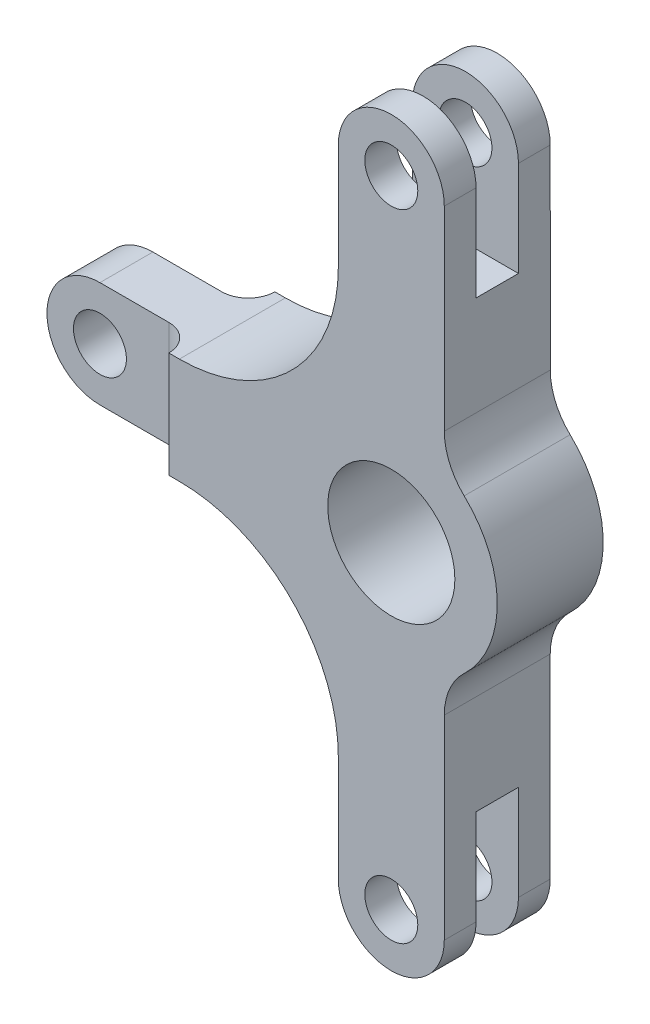
ISO-10303-21;
HEADER;
FILE_DESCRIPTION(('STEP AP214'),'2;1');
FILE_NAME('part.step','',(''),(''),'','','');
FILE_SCHEMA(('AUTOMOTIVE_DESIGN { 1 0 10303 214 1 1 1 1 }'));
ENDSEC;
DATA;
#1=APPLICATION_CONTEXT('core data for automotive mechanical design processes');
#2=APPLICATION_PROTOCOL_DEFINITION('international standard','automotive_design',2000,#1);
#3=PRODUCT_CONTEXT('',#1,'mechanical');
#4=PRODUCT('Part','Part','',(#3));
#5=PRODUCT_RELATED_PRODUCT_CATEGORY('part','',(#4));
#6=PRODUCT_DEFINITION_FORMATION('','',#4);
#7=PRODUCT_DEFINITION_CONTEXT('part definition',#1,'design');
#8=PRODUCT_DEFINITION('design','',#6,#7);
#9=PRODUCT_DEFINITION_SHAPE('','',#8);
#10=(LENGTH_UNIT() NAMED_UNIT(*) SI_UNIT(.MILLI.,.METRE.));
#11=(NAMED_UNIT(*) PLANE_ANGLE_UNIT() SI_UNIT($,.RADIAN.));
#12=(NAMED_UNIT(*) SI_UNIT($,.STERADIAN.) SOLID_ANGLE_UNIT());
#13=UNCERTAINTY_MEASURE_WITH_UNIT(LENGTH_MEASURE(1.E-05),#10,'distance_accuracy_value','');
#14=(GEOMETRIC_REPRESENTATION_CONTEXT(3) GLOBAL_UNCERTAINTY_ASSIGNED_CONTEXT((#13)) GLOBAL_UNIT_ASSIGNED_CONTEXT((#10,
#11,#12)) REPRESENTATION_CONTEXT('',''));
#15=CARTESIAN_POINT('',(0.,0.,0.));
#16=DIRECTION('',(0.,0.,1.));
#17=DIRECTION('',(1.,0.,0.));
#18=AXIS2_PLACEMENT_3D('',#15,#16,#17);
#19=CARTESIAN_POINT('',(-762.,127.,127.));
#20=DIRECTION('',(0.,-1.,0.));
#21=DIRECTION('',(1.,0.,0.));
#22=AXIS2_PLACEMENT_3D('',#19,#20,#21);
#23=PLANE('',#22);
#24=CARTESIAN_POINT('',(-596.9,127.,-127.));
#25=DIRECTION('',(0.,1.,0.));
#26=DIRECTION('',(-1.,0.,0.));
#27=AXIS2_PLACEMENT_3D('',#24,#25,#26);
#28=CIRCLE('',#27,63.5);
#29=CARTESIAN_POINT('',(-596.9,127.,-63.5));
#30=VERTEX_POINT('',#29);
#31=CARTESIAN_POINT('',(-533.4,127.,-127.));
#32=VERTEX_POINT('',#31);
#33=EDGE_CURVE('E226',#30,#32,#28,.T.);
#34=ORIENTED_EDGE('',*,*,#33,.F.);
#35=DIRECTION('',(1.,0.,0.));
#36=VECTOR('',#35,1.);
#37=CARTESIAN_POINT('',(0.,127.,-63.5));
#38=LINE('',#37,#36);
#39=CARTESIAN_POINT('',(-762.,127.,-63.5));
#40=VERTEX_POINT('',#39);
#41=EDGE_CURVE('E214',#40,#30,#38,.T.);
#42=ORIENTED_EDGE('',*,*,#41,.F.);
#43=DIRECTION('',(0.,0.,-1.));
#44=VECTOR('',#43,1.);
#45=CARTESIAN_POINT('',(-762.,127.,127.));
#46=LINE('',#45,#44);
#47=CARTESIAN_POINT('',(-762.,127.,63.5));
#48=VERTEX_POINT('',#47);
#49=EDGE_CURVE('E387',#48,#40,#46,.T.);
#50=ORIENTED_EDGE('',*,*,#49,.F.);
#51=DIRECTION('',(1.,0.,0.));
#52=VECTOR('',#51,1.);
#53=CARTESIAN_POINT('',(0.,127.,63.5));
#54=LINE('',#53,#52);
#55=CARTESIAN_POINT('',(-596.9,127.,63.5));
#56=VERTEX_POINT('',#55);
#57=EDGE_CURVE('E237',#48,#56,#54,.T.);
#58=ORIENTED_EDGE('',*,*,#57,.T.);
#59=CARTESIAN_POINT('',(-596.9,127.,127.));
#60=DIRECTION('',(0.,1.,0.));
#61=DIRECTION('',(-1.,0.,0.));
#62=AXIS2_PLACEMENT_3D('',#59,#60,#61);
#63=CIRCLE('',#62,63.5);
#64=CARTESIAN_POINT('',(-533.4,127.,127.));
#65=VERTEX_POINT('',#64);
#66=EDGE_CURVE('E240',#65,#56,#63,.T.);
#67=ORIENTED_EDGE('',*,*,#66,.F.);
#68=DIRECTION('',(-1.,0.,0.));
#69=VECTOR('',#68,1.);
#70=CARTESIAN_POINT('',(-762.,127.,127.));
#71=LINE('',#70,#69);
#72=CARTESIAN_POINT('',(-508.,127.,127.));
#73=VERTEX_POINT('',#72);
#74=EDGE_CURVE('E348',#73,#65,#71,.T.);
#75=ORIENTED_EDGE('',*,*,#74,.F.);
#76=DIRECTION('',(0.,0.,-1.));
#77=VECTOR('',#76,1.);
#78=CARTESIAN_POINT('',(-508.,127.,127.));
#79=LINE('',#78,#77);
#80=CARTESIAN_POINT('',(-508.,127.,-127.));
#81=VERTEX_POINT('',#80);
#82=EDGE_CURVE('E390',#73,#81,#79,.T.);
#83=ORIENTED_EDGE('',*,*,#82,.T.);
#84=DIRECTION('',(-1.,0.,0.));
#85=VECTOR('',#84,1.);
#86=CARTESIAN_POINT('',(-762.,127.,-127.));
#87=LINE('',#86,#85);
#88=EDGE_CURVE('E380',#81,#32,#87,.T.);
#89=ORIENTED_EDGE('',*,*,#88,.T.);
#90=EDGE_LOOP('',(#34,#42,#50,#58,#67,#75,#83,#89));
#91=FACE_BOUND('',#90,.T.);
#92=ADVANCED_FACE('F32',(#91),#23,.F.);
#93=CARTESIAN_POINT('',(-762.,0.,127.));
#94=DIRECTION('',(0.,0.,-1.));
#95=DIRECTION('',(-1.,0.,0.));
#96=AXIS2_PLACEMENT_3D('',#93,#94,#95);
#97=CYLINDRICAL_SURFACE('',#96,127.);
#98=ORIENTED_EDGE('',*,*,#49,.T.);
#99=CARTESIAN_POINT('',(-762.,0.,-63.5));
#100=DIRECTION('',(0.,0.,1.));
#101=DIRECTION('',(1.,0.,0.));
#102=AXIS2_PLACEMENT_3D('',#99,#100,#101);
#103=CIRCLE('',#102,127.);
#104=CARTESIAN_POINT('',(-762.,-127.,-63.5));
#105=VERTEX_POINT('',#104);
#106=EDGE_CURVE('E248',#40,#105,#103,.T.);
#107=ORIENTED_EDGE('',*,*,#106,.T.);
#108=DIRECTION('',(0.,0.,-1.));
#109=VECTOR('',#108,1.);
#110=CARTESIAN_POINT('',(-762.,-127.,127.));
#111=LINE('',#110,#109);
#112=CARTESIAN_POINT('',(-762.,-127.,63.5));
#113=VERTEX_POINT('',#112);
#114=EDGE_CURVE('E225',#113,#105,#111,.T.);
#115=ORIENTED_EDGE('',*,*,#114,.F.);
#116=CARTESIAN_POINT('',(-762.,0.,63.5));
#117=DIRECTION('',(0.,0.,1.));
#118=DIRECTION('',(1.,0.,0.));
#119=AXIS2_PLACEMENT_3D('',#116,#117,#118);
#120=CIRCLE('',#119,127.);
#121=EDGE_CURVE('E246',#48,#113,#120,.T.);
#122=ORIENTED_EDGE('',*,*,#121,.F.);
#123=EDGE_LOOP('',(#98,#107,#115,#122));
#124=FACE_BOUND('',#123,.T.);
#125=ADVANCED_FACE('F451',(#124),#97,.T.);
#126=CARTESIAN_POINT('',(-508.,-127.,127.));
#127=DIRECTION('',(0.,1.,0.));
#128=DIRECTION('',(-1.,0.,0.));
#129=AXIS2_PLACEMENT_3D('',#126,#127,#128);
#130=PLANE('',#129);
#131=ORIENTED_EDGE('',*,*,#114,.T.);
#132=DIRECTION('',(1.,0.,0.));
#133=VECTOR('',#132,1.);
#134=CARTESIAN_POINT('',(0.,-127.,-63.5));
#135=LINE('',#134,#133);
#136=CARTESIAN_POINT('',(-596.9,-127.,-63.5));
#137=VERTEX_POINT('',#136);
#138=EDGE_CURVE('E211',#105,#137,#135,.T.);
#139=ORIENTED_EDGE('',*,*,#138,.T.);
#140=CARTESIAN_POINT('',(-596.9,-127.,-127.));
#141=DIRECTION('',(0.,1.,0.));
#142=DIRECTION('',(-1.,0.,0.));
#143=AXIS2_PLACEMENT_3D('',#140,#141,#142);
#144=CIRCLE('',#143,63.5);
#145=CARTESIAN_POINT('',(-533.4,-127.,-127.));
#146=VERTEX_POINT('',#145);
#147=EDGE_CURVE('E216',#137,#146,#144,.T.);
#148=ORIENTED_EDGE('',*,*,#147,.T.);
#149=DIRECTION('',(1.,0.,0.));
#150=VECTOR('',#149,1.);
#151=CARTESIAN_POINT('',(-508.,-127.,-127.));
#152=LINE('',#151,#150);
#153=CARTESIAN_POINT('',(-508.,-127.,-127.));
#154=VERTEX_POINT('',#153);
#155=EDGE_CURVE('E328',#146,#154,#152,.T.);
#156=ORIENTED_EDGE('',*,*,#155,.T.);
#157=DIRECTION('',(0.,0.,-1.));
#158=VECTOR('',#157,1.);
#159=CARTESIAN_POINT('',(-508.,-127.,127.));
#160=LINE('',#159,#158);
#161=CARTESIAN_POINT('',(-508.,-127.,127.));
#162=VERTEX_POINT('',#161);
#163=EDGE_CURVE('E353',#162,#154,#160,.T.);
#164=ORIENTED_EDGE('',*,*,#163,.F.);
#165=DIRECTION('',(1.,0.,0.));
#166=VECTOR('',#165,1.);
#167=CARTESIAN_POINT('',(-508.,-127.,127.));
#168=LINE('',#167,#166);
#169=CARTESIAN_POINT('',(-533.4,-127.,127.));
#170=VERTEX_POINT('',#169);
#171=EDGE_CURVE('E351',#170,#162,#168,.T.);
#172=ORIENTED_EDGE('',*,*,#171,.F.);
#173=CARTESIAN_POINT('',(-596.9,-127.,127.));
#174=DIRECTION('',(0.,1.,0.));
#175=DIRECTION('',(-1.,0.,0.));
#176=AXIS2_PLACEMENT_3D('',#173,#174,#175);
#177=CIRCLE('',#176,63.5);
#178=CARTESIAN_POINT('',(-596.9,-127.,63.5));
#179=VERTEX_POINT('',#178);
#180=EDGE_CURVE('E233',#170,#179,#177,.T.);
#181=ORIENTED_EDGE('',*,*,#180,.T.);
#182=DIRECTION('',(1.,0.,0.));
#183=VECTOR('',#182,1.);
#184=CARTESIAN_POINT('',(0.,-127.,63.5));
#185=LINE('',#184,#183);
#186=EDGE_CURVE('E236',#113,#179,#185,.T.);
#187=ORIENTED_EDGE('',*,*,#186,.F.);
#188=EDGE_LOOP('',(#131,#139,#148,#156,#164,#172,#181,#187));
#189=FACE_BOUND('',#188,.T.);
#190=ADVANCED_FACE('F222',(#189),#130,.F.);
#191=CARTESIAN_POINT('',(0.,-762.,127.));
#192=DIRECTION('',(0.,0.,-1.));
#193=DIRECTION('',(-1.,0.,0.));
#194=AXIS2_PLACEMENT_3D('',#191,#192,#193);
#195=CYLINDRICAL_SURFACE('',#194,127.);
#196=DIRECTION('',(0.,0.,-1.));
#197=VECTOR('',#196,1.);
#198=CARTESIAN_POINT('',(127.,-762.,127.));
#199=LINE('',#198,#197);
#200=CARTESIAN_POINT('',(127.,-762.,-50.8));
#201=VERTEX_POINT('',#200);
#202=CARTESIAN_POINT('',(127.,-762.,-127.));
#203=VERTEX_POINT('',#202);
#204=EDGE_CURVE('E416',#201,#203,#199,.T.);
#205=ORIENTED_EDGE('',*,*,#204,.F.);
#206=CARTESIAN_POINT('',(0.,-762.,-50.8));
#207=DIRECTION('',(0.,0.,-1.));
#208=DIRECTION('',(-1.,0.,0.));
#209=AXIS2_PLACEMENT_3D('',#206,#207,#208);
#210=CIRCLE('',#209,127.);
#211=CARTESIAN_POINT('',(-127.,-762.,-50.8));
#212=VERTEX_POINT('',#211);
#213=EDGE_CURVE('E274',#201,#212,#210,.T.);
#214=ORIENTED_EDGE('',*,*,#213,.T.);
#215=DIRECTION('',(0.,0.,-1.));
#216=VECTOR('',#215,1.);
#217=CARTESIAN_POINT('',(-127.,-762.,127.));
#218=LINE('',#217,#216);
#219=CARTESIAN_POINT('',(-127.,-762.,-127.));
#220=VERTEX_POINT('',#219);
#221=EDGE_CURVE('E420',#212,#220,#218,.T.);
#222=ORIENTED_EDGE('',*,*,#221,.T.);
#223=CARTESIAN_POINT('',(0.,-762.,-127.));
#224=DIRECTION('',(0.,0.,1.));
#225=DIRECTION('',(1.,0.,0.));
#226=AXIS2_PLACEMENT_3D('',#223,#224,#225);
#227=CIRCLE('',#226,127.);
#228=EDGE_CURVE('E359',#220,#203,#227,.T.);
#229=ORIENTED_EDGE('',*,*,#228,.T.);
#230=EDGE_LOOP('',(#205,#214,#222,#229));
#231=FACE_BOUND('',#230,.T.);
#232=ADVANCED_FACE('F513',(#231),#195,.T.);
#233=CARTESIAN_POINT('',(0.,762.,127.));
#234=DIRECTION('',(0.,0.,-1.));
#235=DIRECTION('',(-1.,0.,0.));
#236=AXIS2_PLACEMENT_3D('',#233,#234,#235);
#237=CYLINDRICAL_SURFACE('',#236,127.);
#238=CARTESIAN_POINT('',(0.,762.,50.8));
#239=DIRECTION('',(0.,0.,1.));
#240=DIRECTION('',(1.,0.,0.));
#241=AXIS2_PLACEMENT_3D('',#238,#239,#240);
#242=CIRCLE('',#241,127.);
#243=CARTESIAN_POINT('',(127.,762.,50.8));
#244=VERTEX_POINT('',#243);
#245=CARTESIAN_POINT('',(-127.,762.,50.8));
#246=VERTEX_POINT('',#245);
#247=EDGE_CURVE('E294',#244,#246,#242,.T.);
#248=ORIENTED_EDGE('',*,*,#247,.T.);
#249=DIRECTION('',(0.,0.,-1.));
#250=VECTOR('',#249,1.);
#251=CARTESIAN_POINT('',(-127.,762.,127.));
#252=LINE('',#251,#250);
#253=CARTESIAN_POINT('',(-127.,762.,127.));
#254=VERTEX_POINT('',#253);
#255=EDGE_CURVE('E397',#254,#246,#252,.T.);
#256=ORIENTED_EDGE('',*,*,#255,.F.);
#257=CARTESIAN_POINT('',(0.,762.,127.));
#258=DIRECTION('',(0.,0.,1.));
#259=DIRECTION('',(1.,0.,0.));
#260=AXIS2_PLACEMENT_3D('',#257,#258,#259);
#261=CIRCLE('',#260,127.);
#262=CARTESIAN_POINT('',(127.,762.,127.));
#263=VERTEX_POINT('',#262);
#264=EDGE_CURVE('E342',#263,#254,#261,.T.);
#265=ORIENTED_EDGE('',*,*,#264,.F.);
#266=DIRECTION('',(0.,0.,-1.));
#267=VECTOR('',#266,1.);
#268=CARTESIAN_POINT('',(127.,762.,127.));
#269=LINE('',#268,#267);
#270=EDGE_CURVE('E401',#263,#244,#269,.T.);
#271=ORIENTED_EDGE('',*,*,#270,.T.);
#272=EDGE_LOOP('',(#248,#256,#265,#271));
#273=FACE_BOUND('',#272,.T.);
#274=ADVANCED_FACE('F558',(#273),#237,.T.);
#275=CARTESIAN_POINT('',(0.,762.,127.));
#276=DIRECTION('',(0.,0.,-1.));
#277=DIRECTION('',(-1.,0.,0.));
#278=AXIS2_PLACEMENT_3D('',#275,#276,#277);
#279=CYLINDRICAL_SURFACE('',#278,63.5000000000001);
#280=CARTESIAN_POINT('',(0.,762.,50.8));
#281=DIRECTION('',(0.,0.,1.));
#282=DIRECTION('',(1.,0.,0.));
#283=AXIS2_PLACEMENT_3D('',#280,#281,#282);
#284=CIRCLE('',#283,63.5000000000001);
#285=CARTESIAN_POINT('',(63.5000000000001,762.,50.8));
#286=VERTEX_POINT('',#285);
#287=EDGE_CURVE('E290',#286,#286,#284,.T.);
#288=ORIENTED_EDGE('',*,*,#287,.F.);
#289=EDGE_LOOP('',(#288));
#290=FACE_BOUND('',#289,.T.);
#291=CARTESIAN_POINT('',(0.,762.,127.));
#292=DIRECTION('',(0.,0.,1.));
#293=DIRECTION('',(1.,0.,0.));
#294=AXIS2_PLACEMENT_3D('',#291,#292,#293);
#295=CIRCLE('',#294,63.5000000000001);
#296=CARTESIAN_POINT('',(63.5000000000001,762.,127.));
#297=VERTEX_POINT('',#296);
#298=EDGE_CURVE('E318',#297,#297,#295,.T.);
#299=ORIENTED_EDGE('',*,*,#298,.T.);
#300=EDGE_LOOP('',(#299));
#301=FACE_BOUND('',#300,.T.);
#302=ADVANCED_FACE('F591',(#290,#301),#279,.F.);
#303=CARTESIAN_POINT('',(0.,-762.,127.));
#304=DIRECTION('',(0.,0.,-1.));
#305=DIRECTION('',(-1.,0.,0.));
#306=AXIS2_PLACEMENT_3D('',#303,#304,#305);
#307=CYLINDRICAL_SURFACE('',#306,63.5000000000001);
#308=CARTESIAN_POINT('',(0.,-762.,-50.8));
#309=DIRECTION('',(0.,0.,-1.));
#310=DIRECTION('',(-1.,0.,0.));
#311=AXIS2_PLACEMENT_3D('',#308,#309,#310);
#312=CIRCLE('',#311,63.5000000000001);
#313=CARTESIAN_POINT('',(-63.5,-762.,-50.8));
#314=VERTEX_POINT('',#313);
#315=EDGE_CURVE('E270',#314,#314,#312,.T.);
#316=ORIENTED_EDGE('',*,*,#315,.F.);
#317=EDGE_LOOP('',(#316));
#318=FACE_BOUND('',#317,.T.);
#319=CARTESIAN_POINT('',(0.,-762.,-127.));
#320=DIRECTION('',(0.,0.,1.));
#321=DIRECTION('',(1.,0.,0.));
#322=AXIS2_PLACEMENT_3D('',#319,#320,#321);
#323=CIRCLE('',#322,63.5000000000001);
#324=CARTESIAN_POINT('',(63.5000000000002,-762.,-127.));
#325=VERTEX_POINT('',#324);
#326=EDGE_CURVE('E309',#325,#325,#323,.T.);
#327=ORIENTED_EDGE('',*,*,#326,.F.);
#328=EDGE_LOOP('',(#327));
#329=FACE_BOUND('',#328,.T.);
#330=ADVANCED_FACE('F581',(#318,#329),#307,.F.);
#331=CARTESIAN_POINT('',(-508.,-508.,127.));
#332=DIRECTION('',(0.,0.,1.));
#333=DIRECTION('',(1.,0.,0.));
#334=AXIS2_PLACEMENT_3D('',#331,#332,#333);
#335=PLANE('',#334);
#336=DIRECTION('',(0.,1.,0.));
#337=VECTOR('',#336,1.);
#338=CARTESIAN_POINT('',(-533.4,-127.,127.));
#339=LINE('',#338,#337);
#340=EDGE_CURVE('E239',#170,#65,#339,.T.);
#341=ORIENTED_EDGE('',*,*,#340,.F.);
#342=ORIENTED_EDGE('',*,*,#171,.T.);
#343=CARTESIAN_POINT('',(-508.,-508.,127.));
#344=DIRECTION('',(0.,0.,-1.));
#345=DIRECTION('',(1.,0.,0.));
#346=AXIS2_PLACEMENT_3D('',#343,#344,#345);
#347=CIRCLE('',#346,381.);
#348=CARTESIAN_POINT('',(-127.,-508.,127.));
#349=VERTEX_POINT('',#348);
#350=EDGE_CURVE('E324',#162,#349,#347,.T.);
#351=ORIENTED_EDGE('',*,*,#350,.T.);
#352=DIRECTION('',(0.,-1.,0.));
#353=VECTOR('',#352,1.);
#354=CARTESIAN_POINT('',(-127.,-508.,127.));
#355=LINE('',#354,#353);
#356=CARTESIAN_POINT('',(-127.,-762.,127.));
#357=VERTEX_POINT('',#356);
#358=EDGE_CURVE('E327',#349,#357,#355,.T.);
#359=ORIENTED_EDGE('',*,*,#358,.T.);
#360=CARTESIAN_POINT('',(0.,-762.,127.));
#361=DIRECTION('',(0.,0.,1.));
#362=DIRECTION('',(1.,0.,0.));
#363=AXIS2_PLACEMENT_3D('',#360,#361,#362);
#364=CIRCLE('',#363,127.);
#365=CARTESIAN_POINT('',(127.,-762.,127.));
#366=VERTEX_POINT('',#365);
#367=EDGE_CURVE('E330',#357,#366,#364,.T.);
#368=ORIENTED_EDGE('',*,*,#367,.T.);
#369=DIRECTION('',(0.,1.,0.));
#370=VECTOR('',#369,1.);
#371=CARTESIAN_POINT('',(127.,-294.794488402389,127.));
#372=LINE('',#371,#370);
#373=CARTESIAN_POINT('',(127.,-294.794488402389,127.));
#374=VERTEX_POINT('',#373);
#375=EDGE_CURVE('E332',#366,#374,#372,.T.);
#376=ORIENTED_EDGE('',*,*,#375,.T.);
#377=CARTESIAN_POINT('',(279.399648806938,-295.121663465357,127.));
#378=DIRECTION('',(0.,0.,-1.));
#379=DIRECTION('',(1.,0.,0.));
#380=AXIS2_PLACEMENT_3D('',#377,#378,#379);
#381=CIRCLE('',#380,152.4);
#382=CARTESIAN_POINT('',(174.624780504336,-184.451039665848,127.));
#383=VERTEX_POINT('',#382);
#384=EDGE_CURVE('E334',#374,#383,#381,.T.);
#385=ORIENTED_EDGE('',*,*,#384,.T.);
#386=CARTESIAN_POINT('',(0.,0.,127.));
#387=DIRECTION('',(0.,0.,1.));
#388=DIRECTION('',(1.,0.,0.));
#389=AXIS2_PLACEMENT_3D('',#386,#387,#388);
#390=CIRCLE('',#389,254.);
#391=CARTESIAN_POINT('',(174.736020462295,184.345662148586,127.));
#392=VERTEX_POINT('',#391);
#393=EDGE_CURVE('E336',#383,#392,#390,.T.);
#394=ORIENTED_EDGE('',*,*,#393,.T.);
#395=CARTESIAN_POINT('',(279.577632739671,294.953059437738,127.));
#396=DIRECTION('',(0.,0.,-1.));
#397=DIRECTION('',(1.,0.,0.));
#398=AXIS2_PLACEMENT_3D('',#395,#396,#397);
#399=CIRCLE('',#398,152.4);
#400=CARTESIAN_POINT('',(127.177644281484,294.893747175232,127.));
#401=VERTEX_POINT('',#400);
#402=EDGE_CURVE('E338',#392,#401,#399,.T.);
#403=ORIENTED_EDGE('',*,*,#402,.T.);
#404=DIRECTION('',(-0.000380308051033664,0.999999927682891,0.));
#405=VECTOR('',#404,1.);
#406=CARTESIAN_POINT('',(127.,762.,127.));
#407=LINE('',#406,#405);
#408=EDGE_CURVE('E340',#401,#263,#407,.T.);
#409=ORIENTED_EDGE('',*,*,#408,.T.);
#410=ORIENTED_EDGE('',*,*,#264,.T.);
#411=DIRECTION('',(0.,-1.,0.));
#412=VECTOR('',#411,1.);
#413=CARTESIAN_POINT('',(-127.,762.,127.));
#414=LINE('',#413,#412);
#415=CARTESIAN_POINT('',(-127.,508.,127.));
#416=VERTEX_POINT('',#415);
#417=EDGE_CURVE('E344',#254,#416,#414,.T.);
#418=ORIENTED_EDGE('',*,*,#417,.T.);
#419=CARTESIAN_POINT('',(-508.,508.,127.));
#420=DIRECTION('',(0.,0.,-1.));
#421=DIRECTION('',(-1.,0.,0.));
#422=AXIS2_PLACEMENT_3D('',#419,#420,#421);
#423=CIRCLE('',#422,381.);
#424=EDGE_CURVE('E346',#416,#73,#423,.T.);
#425=ORIENTED_EDGE('',*,*,#424,.T.);
#426=ORIENTED_EDGE('',*,*,#74,.T.);
#427=EDGE_LOOP('',(#341,#342,#351,#359,#368,#376,#385,#394,#403,#409,#410,#418,#425,#426));
#428=FACE_BOUND('',#427,.T.);
#429=ORIENTED_EDGE('',*,*,#298,.F.);
#430=EDGE_LOOP('',(#429));
#431=FACE_BOUND('',#430,.T.);
#432=CARTESIAN_POINT('',(0.,-762.,127.));
#433=DIRECTION('',(0.,0.,1.));
#434=DIRECTION('',(1.,0.,0.));
#435=AXIS2_PLACEMENT_3D('',#432,#433,#434);
#436=CIRCLE('',#435,63.5000000000001);
#437=CARTESIAN_POINT('',(63.5000000000002,-762.,127.));
#438=VERTEX_POINT('',#437);
#439=EDGE_CURVE('E312',#438,#438,#436,.T.);
#440=ORIENTED_EDGE('',*,*,#439,.F.);
#441=EDGE_LOOP('',(#440));
#442=FACE_BOUND('',#441,.T.);
#443=CARTESIAN_POINT('',(0.,0.,127.));
#444=DIRECTION('',(0.,0.,1.));
#445=DIRECTION('',(1.,0.,0.));
#446=AXIS2_PLACEMENT_3D('',#443,#444,#445);
#447=CIRCLE('',#446,152.4);
#448=CARTESIAN_POINT('',(152.4,0.,127.));
#449=VERTEX_POINT('',#448);
#450=EDGE_CURVE('E306',#449,#449,#447,.T.);
#451=ORIENTED_EDGE('',*,*,#450,.F.);
#452=EDGE_LOOP('',(#451));
#453=FACE_BOUND('',#452,.T.);
#454=ADVANCED_FACE('F465',(#428,#431,#442,#453),#335,.T.);
#455=CARTESIAN_POINT('',(-508.,-508.,-127.));
#456=DIRECTION('',(0.,0.,1.));
#457=DIRECTION('',(1.,0.,0.));
#458=AXIS2_PLACEMENT_3D('',#455,#456,#457);
#459=PLANE('',#458);
#460=ORIENTED_EDGE('',*,*,#155,.F.);
#461=DIRECTION('',(0.,1.,0.));
#462=VECTOR('',#461,1.);
#463=CARTESIAN_POINT('',(-533.4,-127.,-127.));
#464=LINE('',#463,#462);
#465=EDGE_CURVE('E57',#146,#32,#464,.T.);
#466=ORIENTED_EDGE('',*,*,#465,.T.);
#467=ORIENTED_EDGE('',*,*,#88,.F.);
#468=CARTESIAN_POINT('',(-508.,508.,-127.));
#469=DIRECTION('',(0.,0.,-1.));
#470=DIRECTION('',(-1.,0.,0.));
#471=AXIS2_PLACEMENT_3D('',#468,#469,#470);
#472=CIRCLE('',#471,381.);
#473=CARTESIAN_POINT('',(-127.,508.,-127.));
#474=VERTEX_POINT('',#473);
#475=EDGE_CURVE('E378',#474,#81,#472,.T.);
#476=ORIENTED_EDGE('',*,*,#475,.F.);
#477=DIRECTION('',(0.,-1.,0.));
#478=VECTOR('',#477,1.);
#479=CARTESIAN_POINT('',(-127.,762.,-127.));
#480=LINE('',#479,#478);
#481=CARTESIAN_POINT('',(-127.,762.,-127.));
#482=VERTEX_POINT('',#481);
#483=EDGE_CURVE('E376',#482,#474,#480,.T.);
#484=ORIENTED_EDGE('',*,*,#483,.F.);
#485=CARTESIAN_POINT('',(0.,762.,-127.));
#486=DIRECTION('',(0.,0.,1.));
#487=DIRECTION('',(1.,0.,0.));
#488=AXIS2_PLACEMENT_3D('',#485,#486,#487);
#489=CIRCLE('',#488,127.);
#490=CARTESIAN_POINT('',(127.,762.,-127.));
#491=VERTEX_POINT('',#490);
#492=EDGE_CURVE('E373',#491,#482,#489,.T.);
#493=ORIENTED_EDGE('',*,*,#492,.F.);
#494=DIRECTION('',(-0.000380308051033664,0.999999927682891,0.));
#495=VECTOR('',#494,1.);
#496=CARTESIAN_POINT('',(127.,762.,-127.));
#497=LINE('',#496,#495);
#498=CARTESIAN_POINT('',(127.177644281484,294.893747175232,-127.));
#499=VERTEX_POINT('',#498);
#500=EDGE_CURVE('E370',#499,#491,#497,.T.);
#501=ORIENTED_EDGE('',*,*,#500,.F.);
#502=CARTESIAN_POINT('',(279.577632739671,294.953059437738,-127.));
#503=DIRECTION('',(0.,0.,-1.));
#504=DIRECTION('',(1.,0.,0.));
#505=AXIS2_PLACEMENT_3D('',#502,#503,#504);
#506=CIRCLE('',#505,152.4);
#507=CARTESIAN_POINT('',(174.736020462295,184.345662148586,-127.));
#508=VERTEX_POINT('',#507);
#509=EDGE_CURVE('E368',#508,#499,#506,.T.);
#510=ORIENTED_EDGE('',*,*,#509,.F.);
#511=CARTESIAN_POINT('',(0.,0.,-127.));
#512=DIRECTION('',(0.,0.,1.));
#513=DIRECTION('',(1.,0.,0.));
#514=AXIS2_PLACEMENT_3D('',#511,#512,#513);
#515=CIRCLE('',#514,254.);
#516=CARTESIAN_POINT('',(174.624780504336,-184.451039665848,-127.));
#517=VERTEX_POINT('',#516);
#518=EDGE_CURVE('E366',#517,#508,#515,.T.);
#519=ORIENTED_EDGE('',*,*,#518,.F.);
#520=CARTESIAN_POINT('',(279.399648806938,-295.121663465357,-127.));
#521=DIRECTION('',(0.,0.,-1.));
#522=DIRECTION('',(1.,0.,0.));
#523=AXIS2_PLACEMENT_3D('',#520,#521,#522);
#524=CIRCLE('',#523,152.4);
#525=CARTESIAN_POINT('',(127.,-294.794488402389,-127.));
#526=VERTEX_POINT('',#525);
#527=EDGE_CURVE('E364',#526,#517,#524,.T.);
#528=ORIENTED_EDGE('',*,*,#527,.F.);
#529=DIRECTION('',(0.,1.,0.));
#530=VECTOR('',#529,1.);
#531=CARTESIAN_POINT('',(127.,-294.794488402389,-127.));
#532=LINE('',#531,#530);
#533=EDGE_CURVE('E362',#203,#526,#532,.T.);
#534=ORIENTED_EDGE('',*,*,#533,.F.);
#535=ORIENTED_EDGE('',*,*,#228,.F.);
#536=DIRECTION('',(0.,-1.,0.));
#537=VECTOR('',#536,1.);
#538=CARTESIAN_POINT('',(-127.,-508.,-127.));
#539=LINE('',#538,#537);
#540=CARTESIAN_POINT('',(-127.,-508.,-127.));
#541=VERTEX_POINT('',#540);
#542=EDGE_CURVE('E356',#541,#220,#539,.T.);
#543=ORIENTED_EDGE('',*,*,#542,.F.);
#544=CARTESIAN_POINT('',(-508.,-508.,-127.));
#545=DIRECTION('',(0.,0.,-1.));
#546=DIRECTION('',(1.,0.,0.));
#547=AXIS2_PLACEMENT_3D('',#544,#545,#546);
#548=CIRCLE('',#547,381.);
#549=EDGE_CURVE('E321',#154,#541,#548,.T.);
#550=ORIENTED_EDGE('',*,*,#549,.F.);
#551=EDGE_LOOP('',(#460,#466,#467,#476,#484,#493,#501,#510,#519,#528,#534,#535,#543,#550));
#552=FACE_BOUND('',#551,.T.);
#553=CARTESIAN_POINT('',(0.,762.,-127.));
#554=DIRECTION('',(0.,0.,1.));
#555=DIRECTION('',(1.,0.,0.));
#556=AXIS2_PLACEMENT_3D('',#553,#554,#555);
#557=CIRCLE('',#556,63.5000000000001);
#558=CARTESIAN_POINT('',(63.5000000000001,762.,-127.));
#559=VERTEX_POINT('',#558);
#560=EDGE_CURVE('E315',#559,#559,#557,.T.);
#561=ORIENTED_EDGE('',*,*,#560,.T.);
#562=EDGE_LOOP('',(#561));
#563=FACE_BOUND('',#562,.T.);
#564=ORIENTED_EDGE('',*,*,#326,.T.);
#565=EDGE_LOOP('',(#564));
#566=FACE_BOUND('',#565,.T.);
#567=CARTESIAN_POINT('',(0.,0.,-127.));
#568=DIRECTION('',(0.,0.,1.));
#569=DIRECTION('',(1.,0.,0.));
#570=AXIS2_PLACEMENT_3D('',#567,#568,#569);
#571=CIRCLE('',#570,152.4);
#572=CARTESIAN_POINT('',(152.4,0.,-127.));
#573=VERTEX_POINT('',#572);
#574=EDGE_CURVE('E305',#573,#573,#571,.T.);
#575=ORIENTED_EDGE('',*,*,#574,.T.);
#576=EDGE_LOOP('',(#575));
#577=FACE_BOUND('',#576,.T.);
#578=ADVANCED_FACE('F455',(#552,#563,#566,#577),#459,.F.);
#579=CARTESIAN_POINT('',(-508.,-508.,127.));
#580=DIRECTION('',(0.,0.,-1.));
#581=DIRECTION('',(-1.,0.,0.));
#582=AXIS2_PLACEMENT_3D('',#579,#580,#581);
#583=CYLINDRICAL_SURFACE('',#582,381.);
#584=ORIENTED_EDGE('',*,*,#549,.T.);
#585=DIRECTION('',(0.,0.,-1.));
#586=VECTOR('',#585,1.);
#587=CARTESIAN_POINT('',(-127.,-508.,127.));
#588=LINE('',#587,#586);
#589=EDGE_CURVE('E424',#349,#541,#588,.T.);
#590=ORIENTED_EDGE('',*,*,#589,.F.);
#591=ORIENTED_EDGE('',*,*,#350,.F.);
#592=ORIENTED_EDGE('',*,*,#163,.T.);
#593=EDGE_LOOP('',(#584,#590,#591,#592));
#594=FACE_BOUND('',#593,.T.);
#595=ADVANCED_FACE('F34',(#594),#583,.F.);
#596=CARTESIAN_POINT('',(-127.,-508.,127.));
#597=DIRECTION('',(1.,0.,0.));
#598=DIRECTION('',(0.,0.,-1.));
#599=AXIS2_PLACEMENT_3D('',#596,#597,#598);
#600=PLANE('',#599);
#601=ORIENTED_EDGE('',*,*,#221,.F.);
#602=DIRECTION('',(0.,1.,0.));
#603=VECTOR('',#602,1.);
#604=CARTESIAN_POINT('',(-127.,-508.,-50.8));
#605=LINE('',#604,#603);
#606=CARTESIAN_POINT('',(-127.,-533.4,-50.8));
#607=VERTEX_POINT('',#606);
#608=EDGE_CURVE('E277',#212,#607,#605,.T.);
#609=ORIENTED_EDGE('',*,*,#608,.T.);
#610=DIRECTION('',(0.,0.,1.));
#611=VECTOR('',#610,1.);
#612=CARTESIAN_POINT('',(-127.,-533.4,127.));
#613=LINE('',#612,#611);
#614=CARTESIAN_POINT('',(-127.,-533.4,50.8));
#615=VERTEX_POINT('',#614);
#616=EDGE_CURVE('E302',#607,#615,#613,.T.);
#617=ORIENTED_EDGE('',*,*,#616,.T.);
#618=DIRECTION('',(0.,-1.,0.));
#619=VECTOR('',#618,1.);
#620=CARTESIAN_POINT('',(-127.,-508.,50.8));
#621=LINE('',#620,#619);
#622=CARTESIAN_POINT('',(-127.,-762.,50.8));
#623=VERTEX_POINT('',#622);
#624=EDGE_CURVE('E267',#615,#623,#621,.T.);
#625=ORIENTED_EDGE('',*,*,#624,.T.);
#626=EDGE_CURVE('E421',#357,#623,#218,.T.);
#627=ORIENTED_EDGE('',*,*,#626,.F.);
#628=ORIENTED_EDGE('',*,*,#358,.F.);
#629=ORIENTED_EDGE('',*,*,#589,.T.);
#630=ORIENTED_EDGE('',*,*,#542,.T.);
#631=EDGE_LOOP('',(#601,#609,#617,#625,#627,#628,#629,#630));
#632=FACE_BOUND('',#631,.T.);
#633=ADVANCED_FACE('F516',(#632),#600,.F.);
#634=CARTESIAN_POINT('',(0.,-762.,50.8));
#635=DIRECTION('',(0.,0.,1.));
#636=DIRECTION('',(1.,0.,0.));
#637=AXIS2_PLACEMENT_3D('',#634,#635,#636);
#638=CIRCLE('',#637,127.);
#639=CARTESIAN_POINT('',(127.,-762.,50.8));
#640=VERTEX_POINT('',#639);
#641=EDGE_CURVE('E265',#623,#640,#638,.T.);
#642=ORIENTED_EDGE('',*,*,#641,.T.);
#643=EDGE_CURVE('E417',#366,#640,#199,.T.);
#644=ORIENTED_EDGE('',*,*,#643,.F.);
#645=ORIENTED_EDGE('',*,*,#367,.F.);
#646=ORIENTED_EDGE('',*,*,#626,.T.);
#647=EDGE_LOOP('',(#642,#644,#645,#646));
#648=FACE_BOUND('',#647,.T.);
#649=ADVANCED_FACE('F520',(#648),#195,.T.);
#650=CARTESIAN_POINT('',(127.,-294.794488402389,127.));
#651=DIRECTION('',(-1.,0.,0.));
#652=DIRECTION('',(0.,-1.,0.));
#653=AXIS2_PLACEMENT_3D('',#650,#651,#652);
#654=PLANE('',#653);
#655=DIRECTION('',(0.,0.,-1.));
#656=VECTOR('',#655,1.);
#657=CARTESIAN_POINT('',(127.,-533.4,127.));
#658=LINE('',#657,#656);
#659=CARTESIAN_POINT('',(127.,-533.4,50.8));
#660=VERTEX_POINT('',#659);
#661=CARTESIAN_POINT('',(127.,-533.4,-50.8));
#662=VERTEX_POINT('',#661);
#663=EDGE_CURVE('E11',#660,#662,#658,.T.);
#664=ORIENTED_EDGE('',*,*,#663,.T.);
#665=DIRECTION('',(0.,-1.,0.));
#666=VECTOR('',#665,1.);
#667=CARTESIAN_POINT('',(127.,-294.794488402389,-50.8));
#668=LINE('',#667,#666);
#669=EDGE_CURVE('E271',#662,#201,#668,.T.);
#670=ORIENTED_EDGE('',*,*,#669,.T.);
#671=ORIENTED_EDGE('',*,*,#204,.T.);
#672=ORIENTED_EDGE('',*,*,#533,.T.);
#673=DIRECTION('',(0.,0.,-1.));
#674=VECTOR('',#673,1.);
#675=CARTESIAN_POINT('',(127.,-294.794488402389,127.));
#676=LINE('',#675,#674);
#677=EDGE_CURVE('E413',#374,#526,#676,.T.);
#678=ORIENTED_EDGE('',*,*,#677,.F.);
#679=ORIENTED_EDGE('',*,*,#375,.F.);
#680=ORIENTED_EDGE('',*,*,#643,.T.);
#681=DIRECTION('',(0.,1.,0.));
#682=VECTOR('',#681,1.);
#683=CARTESIAN_POINT('',(127.,-294.794488402389,50.8));
#684=LINE('',#683,#682);
#685=EDGE_CURVE('E262',#640,#660,#684,.T.);
#686=ORIENTED_EDGE('',*,*,#685,.T.);
#687=EDGE_LOOP('',(#664,#670,#671,#672,#678,#679,#680,#686));
#688=FACE_BOUND('',#687,.T.);
#689=ADVANCED_FACE('F508',(#688),#654,.F.);
#690=CARTESIAN_POINT('',(279.399648806938,-295.121663465357,127.));
#691=DIRECTION('',(0.,0.,-1.));
#692=DIRECTION('',(-1.,0.,0.));
#693=AXIS2_PLACEMENT_3D('',#690,#691,#692);
#694=CYLINDRICAL_SURFACE('',#693,152.4);
#695=ORIENTED_EDGE('',*,*,#527,.T.);
#696=DIRECTION('',(0.,0.,-1.));
#697=VECTOR('',#696,1.);
#698=CARTESIAN_POINT('',(174.624780504336,-184.451039665848,127.));
#699=LINE('',#698,#697);
#700=EDGE_CURVE('E410',#383,#517,#699,.T.);
#701=ORIENTED_EDGE('',*,*,#700,.F.);
#702=ORIENTED_EDGE('',*,*,#384,.F.);
#703=ORIENTED_EDGE('',*,*,#677,.T.);
#704=EDGE_LOOP('',(#695,#701,#702,#703));
#705=FACE_BOUND('',#704,.T.);
#706=ADVANCED_FACE('F503',(#705),#694,.F.);
#707=CARTESIAN_POINT('',(0.,0.,127.));
#708=DIRECTION('',(0.,0.,-1.));
#709=DIRECTION('',(-1.,0.,0.));
#710=AXIS2_PLACEMENT_3D('',#707,#708,#709);
#711=CYLINDRICAL_SURFACE('',#710,254.);
#712=ORIENTED_EDGE('',*,*,#518,.T.);
#713=DIRECTION('',(0.,0.,-1.));
#714=VECTOR('',#713,1.);
#715=CARTESIAN_POINT('',(174.736020462295,184.345662148586,127.));
#716=LINE('',#715,#714);
#717=EDGE_CURVE('E407',#392,#508,#716,.T.);
#718=ORIENTED_EDGE('',*,*,#717,.F.);
#719=ORIENTED_EDGE('',*,*,#393,.F.);
#720=ORIENTED_EDGE('',*,*,#700,.T.);
#721=EDGE_LOOP('',(#712,#718,#719,#720));
#722=FACE_BOUND('',#721,.T.);
#723=ADVANCED_FACE('F499',(#722),#711,.T.);
#724=CARTESIAN_POINT('',(279.577632739671,294.953059437738,127.));
#725=DIRECTION('',(0.,0.,-1.));
#726=DIRECTION('',(-1.,0.,0.));
#727=AXIS2_PLACEMENT_3D('',#724,#725,#726);
#728=CYLINDRICAL_SURFACE('',#727,152.4);
#729=ORIENTED_EDGE('',*,*,#509,.T.);
#730=DIRECTION('',(0.,0.,-1.));
#731=VECTOR('',#730,1.);
#732=CARTESIAN_POINT('',(127.177644281484,294.893747175232,127.));
#733=LINE('',#732,#731);
#734=EDGE_CURVE('E404',#401,#499,#733,.T.);
#735=ORIENTED_EDGE('',*,*,#734,.F.);
#736=ORIENTED_EDGE('',*,*,#402,.F.);
#737=ORIENTED_EDGE('',*,*,#717,.T.);
#738=EDGE_LOOP('',(#729,#735,#736,#737));
#739=FACE_BOUND('',#738,.T.);
#740=ADVANCED_FACE('F494',(#739),#728,.F.);
#741=CARTESIAN_POINT('',(127.,762.,127.));
#742=DIRECTION('',(-0.999999927682891,-0.000380308051033664,0.));
#743=DIRECTION('',(0.000380308051033664,-0.999999927682891,0.));
#744=AXIS2_PLACEMENT_3D('',#741,#742,#743);
#745=PLANE('',#744);
#746=DIRECTION('',(0.,0.,1.));
#747=VECTOR('',#746,1.);
#748=CARTESIAN_POINT('',(127.086938426753,533.4,127.));
#749=LINE('',#748,#747);
#750=CARTESIAN_POINT('',(127.086938426753,533.4,-50.8));
#751=VERTEX_POINT('',#750);
#752=CARTESIAN_POINT('',(127.086938426753,533.4,50.8));
#753=VERTEX_POINT('',#752);
#754=EDGE_CURVE('E299',#751,#753,#749,.T.);
#755=ORIENTED_EDGE('',*,*,#754,.T.);
#756=DIRECTION('',(-0.000380308051033664,0.999999927682891,0.));
#757=VECTOR('',#756,1.);
#758=CARTESIAN_POINT('',(127.,762.,50.8));
#759=LINE('',#758,#757);
#760=EDGE_CURVE('E296',#753,#244,#759,.T.);
#761=ORIENTED_EDGE('',*,*,#760,.T.);
#762=ORIENTED_EDGE('',*,*,#270,.F.);
#763=ORIENTED_EDGE('',*,*,#408,.F.);
#764=ORIENTED_EDGE('',*,*,#734,.T.);
#765=ORIENTED_EDGE('',*,*,#500,.T.);
#766=CARTESIAN_POINT('',(127.,762.,-50.8));
#767=VERTEX_POINT('',#766);
#768=EDGE_CURVE('E400',#767,#491,#269,.T.);
#769=ORIENTED_EDGE('',*,*,#768,.F.);
#770=DIRECTION('',(0.000380308051033664,-0.999999927682891,0.));
#771=VECTOR('',#770,1.);
#772=CARTESIAN_POINT('',(127.,762.,-50.8));
#773=LINE('',#772,#771);
#774=EDGE_CURVE('E287',#767,#751,#773,.T.);
#775=ORIENTED_EDGE('',*,*,#774,.T.);
#776=EDGE_LOOP('',(#755,#761,#762,#763,#764,#765,#769,#775));
#777=FACE_BOUND('',#776,.T.);
#778=ADVANCED_FACE('F487',(#777),#745,.F.);
#779=CARTESIAN_POINT('',(-127.,762.,-50.8));
#780=VERTEX_POINT('',#779);
#781=EDGE_CURVE('E396',#780,#482,#252,.T.);
#782=ORIENTED_EDGE('',*,*,#781,.F.);
#783=CARTESIAN_POINT('',(0.,762.,-50.8));
#784=DIRECTION('',(0.,0.,-1.));
#785=DIRECTION('',(-1.,0.,0.));
#786=AXIS2_PLACEMENT_3D('',#783,#784,#785);
#787=CIRCLE('',#786,127.);
#788=EDGE_CURVE('E284',#780,#767,#787,.T.);
#789=ORIENTED_EDGE('',*,*,#788,.T.);
#790=ORIENTED_EDGE('',*,*,#768,.T.);
#791=ORIENTED_EDGE('',*,*,#492,.T.);
#792=EDGE_LOOP('',(#782,#789,#790,#791));
#793=FACE_BOUND('',#792,.T.);
#794=ADVANCED_FACE('F484',(#793),#237,.T.);
#795=CARTESIAN_POINT('',(-127.,762.,127.));
#796=DIRECTION('',(1.,0.,0.));
#797=DIRECTION('',(0.,0.,-1.));
#798=AXIS2_PLACEMENT_3D('',#795,#796,#797);
#799=PLANE('',#798);
#800=ORIENTED_EDGE('',*,*,#255,.T.);
#801=DIRECTION('',(0.,-1.,0.));
#802=VECTOR('',#801,1.);
#803=CARTESIAN_POINT('',(-127.,762.,50.8));
#804=LINE('',#803,#802);
#805=CARTESIAN_POINT('',(-127.,533.4,50.8));
#806=VERTEX_POINT('',#805);
#807=EDGE_CURVE('E291',#246,#806,#804,.T.);
#808=ORIENTED_EDGE('',*,*,#807,.T.);
#809=DIRECTION('',(0.,0.,-1.));
#810=VECTOR('',#809,1.);
#811=CARTESIAN_POINT('',(-127.,533.4,127.));
#812=LINE('',#811,#810);
#813=CARTESIAN_POINT('',(-127.,533.4,-50.8));
#814=VERTEX_POINT('',#813);
#815=EDGE_CURVE('E41',#806,#814,#812,.T.);
#816=ORIENTED_EDGE('',*,*,#815,.T.);
#817=DIRECTION('',(0.,1.,0.));
#818=VECTOR('',#817,1.);
#819=CARTESIAN_POINT('',(-127.,762.,-50.8));
#820=LINE('',#819,#818);
#821=EDGE_CURVE('E281',#814,#780,#820,.T.);
#822=ORIENTED_EDGE('',*,*,#821,.T.);
#823=ORIENTED_EDGE('',*,*,#781,.T.);
#824=ORIENTED_EDGE('',*,*,#483,.T.);
#825=DIRECTION('',(0.,0.,-1.));
#826=VECTOR('',#825,1.);
#827=CARTESIAN_POINT('',(-127.,508.,127.));
#828=LINE('',#827,#826);
#829=EDGE_CURVE('E393',#416,#474,#828,.T.);
#830=ORIENTED_EDGE('',*,*,#829,.F.);
#831=ORIENTED_EDGE('',*,*,#417,.F.);
#832=EDGE_LOOP('',(#800,#808,#816,#822,#823,#824,#830,#831));
#833=FACE_BOUND('',#832,.T.);
#834=ADVANCED_FACE('F479',(#833),#799,.F.);
#835=CARTESIAN_POINT('',(-508.,508.,127.));
#836=DIRECTION('',(0.,0.,-1.));
#837=DIRECTION('',(-1.,0.,0.));
#838=AXIS2_PLACEMENT_3D('',#835,#836,#837);
#839=CYLINDRICAL_SURFACE('',#838,381.);
#840=ORIENTED_EDGE('',*,*,#475,.T.);
#841=ORIENTED_EDGE('',*,*,#82,.F.);
#842=ORIENTED_EDGE('',*,*,#424,.F.);
#843=ORIENTED_EDGE('',*,*,#829,.T.);
#844=EDGE_LOOP('',(#840,#841,#842,#843));
#845=FACE_BOUND('',#844,.T.);
#846=ADVANCED_FACE('F473',(#845),#839,.F.);
#847=CARTESIAN_POINT('',(0.,762.,-50.8));
#848=DIRECTION('',(0.,0.,-1.));
#849=DIRECTION('',(-1.,0.,0.));
#850=AXIS2_PLACEMENT_3D('',#847,#848,#849);
#851=CIRCLE('',#850,63.5000000000001);
#852=CARTESIAN_POINT('',(-63.5000000000001,762.,-50.8));
#853=VERTEX_POINT('',#852);
#854=EDGE_CURVE('E280',#853,#853,#851,.T.);
#855=ORIENTED_EDGE('',*,*,#854,.F.);
#856=EDGE_LOOP('',(#855));
#857=FACE_BOUND('',#856,.T.);
#858=ORIENTED_EDGE('',*,*,#560,.F.);
#859=EDGE_LOOP('',(#858));
#860=FACE_BOUND('',#859,.T.);
#861=ADVANCED_FACE('F553',(#857,#860),#279,.F.);
#862=CARTESIAN_POINT('',(0.,-762.,50.8));
#863=DIRECTION('',(0.,0.,1.));
#864=DIRECTION('',(1.,0.,0.));
#865=AXIS2_PLACEMENT_3D('',#862,#863,#864);
#866=CIRCLE('',#865,63.5000000000001);
#867=CARTESIAN_POINT('',(63.5000000000002,-762.,50.8));
#868=VERTEX_POINT('',#867);
#869=EDGE_CURVE('E254',#868,#868,#866,.T.);
#870=ORIENTED_EDGE('',*,*,#869,.F.);
#871=EDGE_LOOP('',(#870));
#872=FACE_BOUND('',#871,.T.);
#873=ORIENTED_EDGE('',*,*,#439,.T.);
#874=EDGE_LOOP('',(#873));
#875=FACE_BOUND('',#874,.T.);
#876=ADVANCED_FACE('F700',(#872,#875),#307,.F.);
#877=CARTESIAN_POINT('',(0.,0.,127.));
#878=DIRECTION('',(0.,0.,-1.));
#879=DIRECTION('',(-1.,0.,0.));
#880=AXIS2_PLACEMENT_3D('',#877,#878,#879);
#881=CYLINDRICAL_SURFACE('',#880,152.4);
#882=ORIENTED_EDGE('',*,*,#450,.T.);
#883=EDGE_LOOP('',(#882));
#884=FACE_BOUND('',#883,.T.);
#885=ORIENTED_EDGE('',*,*,#574,.F.);
#886=EDGE_LOOP('',(#885));
#887=FACE_BOUND('',#886,.T.);
#888=ADVANCED_FACE('F540',(#884,#887),#881,.F.);
#889=CARTESIAN_POINT('',(-889.,-533.4,50.8));
#890=DIRECTION('',(0.,1.,0.));
#891=DIRECTION('',(0.,0.,1.));
#892=AXIS2_PLACEMENT_3D('',#889,#890,#891);
#893=PLANE('',#892);
#894=DIRECTION('',(1.,0.,0.));
#895=VECTOR('',#894,1.);
#896=CARTESIAN_POINT('',(-889.,-533.4,-50.8));
#897=LINE('',#896,#895);
#898=EDGE_CURVE('E250',#607,#662,#897,.T.);
#899=ORIENTED_EDGE('',*,*,#898,.T.);
#900=ORIENTED_EDGE('',*,*,#663,.F.);
#901=DIRECTION('',(1.,0.,0.));
#902=VECTOR('',#901,1.);
#903=CARTESIAN_POINT('',(-889.,-533.4,50.8));
#904=LINE('',#903,#902);
#905=EDGE_CURVE('E258',#615,#660,#904,.T.);
#906=ORIENTED_EDGE('',*,*,#905,.F.);
#907=ORIENTED_EDGE('',*,*,#616,.F.);
#908=EDGE_LOOP('',(#899,#900,#906,#907));
#909=FACE_BOUND('',#908,.T.);
#910=ADVANCED_FACE('F526',(#909),#893,.F.);
#911=CARTESIAN_POINT('',(-889.,-533.4,-50.8));
#912=DIRECTION('',(0.,0.,-1.));
#913=DIRECTION('',(-1.,0.,0.));
#914=AXIS2_PLACEMENT_3D('',#911,#912,#913);
#915=PLANE('',#914);
#916=ORIENTED_EDGE('',*,*,#315,.T.);
#917=EDGE_LOOP('',(#916));
#918=FACE_BOUND('',#917,.T.);
#919=ORIENTED_EDGE('',*,*,#213,.F.);
#920=ORIENTED_EDGE('',*,*,#669,.F.);
#921=ORIENTED_EDGE('',*,*,#898,.F.);
#922=ORIENTED_EDGE('',*,*,#608,.F.);
#923=EDGE_LOOP('',(#919,#920,#921,#922));
#924=FACE_BOUND('',#923,.T.);
#925=ADVANCED_FACE('F529',(#918,#924),#915,.F.);
#926=CARTESIAN_POINT('',(-889.,-889.,50.8));
#927=DIRECTION('',(0.,0.,1.));
#928=DIRECTION('',(1.,0.,0.));
#929=AXIS2_PLACEMENT_3D('',#926,#927,#928);
#930=PLANE('',#929);
#931=ORIENTED_EDGE('',*,*,#869,.T.);
#932=EDGE_LOOP('',(#931));
#933=FACE_BOUND('',#932,.T.);
#934=ORIENTED_EDGE('',*,*,#905,.T.);
#935=ORIENTED_EDGE('',*,*,#685,.F.);
#936=ORIENTED_EDGE('',*,*,#641,.F.);
#937=ORIENTED_EDGE('',*,*,#624,.F.);
#938=EDGE_LOOP('',(#934,#935,#936,#937));
#939=FACE_BOUND('',#938,.T.);
#940=ADVANCED_FACE('F523',(#933,#939),#930,.F.);
#941=CARTESIAN_POINT('',(-889.,533.4,0.));
#942=DIRECTION('',(0.,-1.,0.));
#943=DIRECTION('',(0.,0.,-1.));
#944=AXIS2_PLACEMENT_3D('',#941,#942,#943);
#945=PLANE('',#944);
#946=DIRECTION('',(1.,0.,0.));
#947=VECTOR('',#946,1.);
#948=CARTESIAN_POINT('',(-889.,533.4,-50.8));
#949=LINE('',#948,#947);
#950=EDGE_CURVE('E255',#814,#751,#949,.T.);
#951=ORIENTED_EDGE('',*,*,#950,.F.);
#952=ORIENTED_EDGE('',*,*,#815,.F.);
#953=DIRECTION('',(1.,0.,0.));
#954=VECTOR('',#953,1.);
#955=CARTESIAN_POINT('',(-889.,533.4,50.8));
#956=LINE('',#955,#954);
#957=EDGE_CURVE('E251',#806,#753,#956,.T.);
#958=ORIENTED_EDGE('',*,*,#957,.T.);
#959=ORIENTED_EDGE('',*,*,#754,.F.);
#960=EDGE_LOOP('',(#951,#952,#958,#959));
#961=FACE_BOUND('',#960,.T.);
#962=ADVANCED_FACE('F537',(#961),#945,.F.);
#963=CARTESIAN_POINT('',(-889.,889.,50.8));
#964=DIRECTION('',(0.,0.,1.));
#965=DIRECTION('',(1.,0.,0.));
#966=AXIS2_PLACEMENT_3D('',#963,#964,#965);
#967=PLANE('',#966);
#968=ORIENTED_EDGE('',*,*,#287,.T.);
#969=EDGE_LOOP('',(#968));
#970=FACE_BOUND('',#969,.T.);
#971=ORIENTED_EDGE('',*,*,#957,.F.);
#972=ORIENTED_EDGE('',*,*,#807,.F.);
#973=ORIENTED_EDGE('',*,*,#247,.F.);
#974=ORIENTED_EDGE('',*,*,#760,.F.);
#975=EDGE_LOOP('',(#971,#972,#973,#974));
#976=FACE_BOUND('',#975,.T.);
#977=ADVANCED_FACE('F603',(#970,#976),#967,.F.);
#978=CARTESIAN_POINT('',(-889.,533.4,-50.8));
#979=DIRECTION('',(0.,0.,-1.));
#980=DIRECTION('',(-1.,0.,0.));
#981=AXIS2_PLACEMENT_3D('',#978,#979,#980);
#982=PLANE('',#981);
#983=ORIENTED_EDGE('',*,*,#854,.T.);
#984=EDGE_LOOP('',(#983));
#985=FACE_BOUND('',#984,.T.);
#986=ORIENTED_EDGE('',*,*,#788,.F.);
#987=ORIENTED_EDGE('',*,*,#821,.F.);
#988=ORIENTED_EDGE('',*,*,#950,.T.);
#989=ORIENTED_EDGE('',*,*,#774,.F.);
#990=EDGE_LOOP('',(#986,#987,#988,#989));
#991=FACE_BOUND('',#990,.T.);
#992=ADVANCED_FACE('F445',(#985,#991),#982,.F.);
#993=CARTESIAN_POINT('',(0.,-127.,63.5));
#994=DIRECTION('',(0.,0.,1.));
#995=DIRECTION('',(1.,0.,0.));
#996=AXIS2_PLACEMENT_3D('',#993,#994,#995);
#997=PLANE('',#996);
#998=CARTESIAN_POINT('',(-762.,0.,63.5));
#999=DIRECTION('',(0.,0.,1.));
#1000=DIRECTION('',(1.,0.,0.));
#1001=AXIS2_PLACEMENT_3D('',#998,#999,#1000);
#1002=CIRCLE('',#1001,63.5);
#1003=CARTESIAN_POINT('',(-698.5,0.,63.5));
#1004=VERTEX_POINT('',#1003);
#1005=EDGE_CURVE('E231',#1004,#1004,#1002,.T.);
#1006=ORIENTED_EDGE('',*,*,#1005,.F.);
#1007=EDGE_LOOP('',(#1006));
#1008=FACE_BOUND('',#1007,.T.);
#1009=ORIENTED_EDGE('',*,*,#121,.T.);
#1010=ORIENTED_EDGE('',*,*,#186,.T.);
#1011=DIRECTION('',(0.,1.,0.));
#1012=VECTOR('',#1011,1.);
#1013=CARTESIAN_POINT('',(-596.9,-127.,63.5));
#1014=LINE('',#1013,#1012);
#1015=EDGE_CURVE('E49',#179,#56,#1014,.T.);
#1016=ORIENTED_EDGE('',*,*,#1015,.T.);
#1017=ORIENTED_EDGE('',*,*,#57,.F.);
#1018=EDGE_LOOP('',(#1009,#1010,#1016,#1017));
#1019=FACE_BOUND('',#1018,.T.);
#1020=ADVANCED_FACE('F441',(#1008,#1019),#997,.T.);
#1021=CARTESIAN_POINT('',(-596.9,-127.,127.));
#1022=DIRECTION('',(0.,1.,0.));
#1023=DIRECTION('',(-1.,0.,0.));
#1024=AXIS2_PLACEMENT_3D('',#1021,#1022,#1023);
#1025=CYLINDRICAL_SURFACE('',#1024,63.5);
#1026=ORIENTED_EDGE('',*,*,#66,.T.);
#1027=ORIENTED_EDGE('',*,*,#1015,.F.);
#1028=ORIENTED_EDGE('',*,*,#180,.F.);
#1029=ORIENTED_EDGE('',*,*,#340,.T.);
#1030=EDGE_LOOP('',(#1026,#1027,#1028,#1029));
#1031=FACE_BOUND('',#1030,.T.);
#1032=ADVANCED_FACE('F444',(#1031),#1025,.F.);
#1033=CARTESIAN_POINT('',(0.,-127.,-63.5));
#1034=DIRECTION('',(0.,0.,1.));
#1035=DIRECTION('',(1.,0.,0.));
#1036=AXIS2_PLACEMENT_3D('',#1033,#1034,#1035);
#1037=PLANE('',#1036);
#1038=CARTESIAN_POINT('',(-762.,0.,-63.5));
#1039=DIRECTION('',(0.,0.,1.));
#1040=DIRECTION('',(1.,0.,0.));
#1041=AXIS2_PLACEMENT_3D('',#1038,#1039,#1040);
#1042=CIRCLE('',#1041,63.5);
#1043=CARTESIAN_POINT('',(-698.5,0.,-63.5));
#1044=VERTEX_POINT('',#1043);
#1045=EDGE_CURVE('E36',#1044,#1044,#1042,.T.);
#1046=ORIENTED_EDGE('',*,*,#1045,.T.);
#1047=EDGE_LOOP('',(#1046));
#1048=FACE_BOUND('',#1047,.T.);
#1049=ORIENTED_EDGE('',*,*,#41,.T.);
#1050=DIRECTION('',(0.,1.,0.));
#1051=VECTOR('',#1050,1.);
#1052=CARTESIAN_POINT('',(-596.9,-127.,-63.5));
#1053=LINE('',#1052,#1051);
#1054=EDGE_CURVE('E208',#137,#30,#1053,.T.);
#1055=ORIENTED_EDGE('',*,*,#1054,.F.);
#1056=ORIENTED_EDGE('',*,*,#138,.F.);
#1057=ORIENTED_EDGE('',*,*,#106,.F.);
#1058=EDGE_LOOP('',(#1049,#1055,#1056,#1057));
#1059=FACE_BOUND('',#1058,.T.);
#1060=ADVANCED_FACE('F209',(#1048,#1059),#1037,.F.);
#1061=CARTESIAN_POINT('',(-596.9,-127.,-127.));
#1062=DIRECTION('',(0.,1.,0.));
#1063=DIRECTION('',(-1.,0.,0.));
#1064=AXIS2_PLACEMENT_3D('',#1061,#1062,#1063);
#1065=CYLINDRICAL_SURFACE('',#1064,63.5);
#1066=ORIENTED_EDGE('',*,*,#33,.T.);
#1067=ORIENTED_EDGE('',*,*,#465,.F.);
#1068=ORIENTED_EDGE('',*,*,#147,.F.);
#1069=ORIENTED_EDGE('',*,*,#1054,.T.);
#1070=EDGE_LOOP('',(#1066,#1067,#1068,#1069));
#1071=FACE_BOUND('',#1070,.T.);
#1072=ADVANCED_FACE('F218',(#1071),#1065,.F.);
#1073=CARTESIAN_POINT('',(-762.,0.,127.));
#1074=DIRECTION('',(0.,0.,-1.));
#1075=DIRECTION('',(-1.,0.,0.));
#1076=AXIS2_PLACEMENT_3D('',#1073,#1074,#1075);
#1077=CYLINDRICAL_SURFACE('',#1076,63.5);
#1078=ORIENTED_EDGE('',*,*,#1045,.F.);
#1079=EDGE_LOOP('',(#1078));
#1080=FACE_BOUND('',#1079,.T.);
#1081=ORIENTED_EDGE('',*,*,#1005,.T.);
#1082=EDGE_LOOP('',(#1081));
#1083=FACE_BOUND('',#1082,.T.);
#1084=ADVANCED_FACE('F439',(#1080,#1083),#1077,.F.);
#1085=CLOSED_SHELL('',(#92,#125,#190,#232,#274,#302,#330,#454,#578,#595,#633,#649,#689,#706,
#723,#740,#778,#794,#834,#846,#861,#876,#888,#910,#925,#940,#962,#977,#992,#1020,#1032,#1060,
#1072,#1084));
#1086=MANIFOLD_SOLID_BREP('B2',#1085);
#1087=ADVANCED_BREP_SHAPE_REPRESENTATION('',(#18,#1086),#14);
#1088=SHAPE_DEFINITION_REPRESENTATION(#9,#1087);
ENDSEC;
END-ISO-10303-21;
